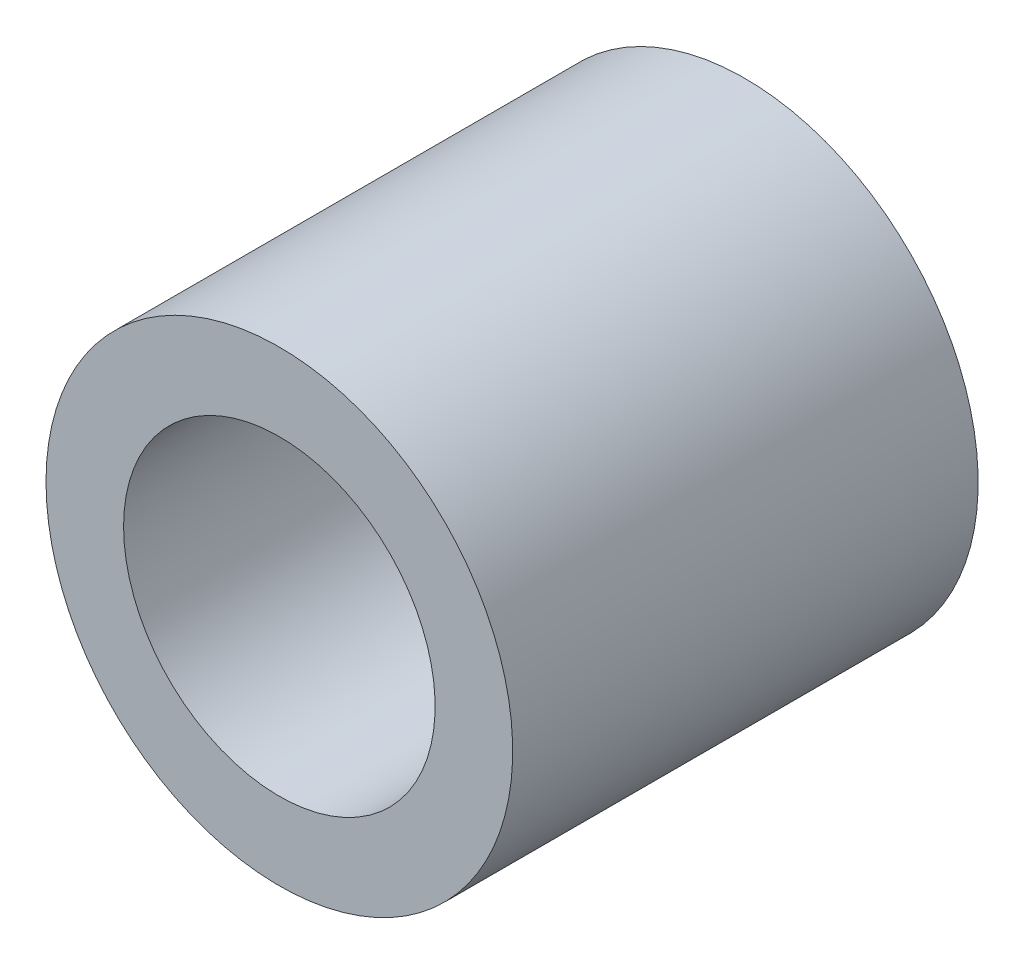
ISO-10303-21;
HEADER;
FILE_DESCRIPTION(('STEP AP214'),'2;1');
FILE_NAME('part.step','',(''),(''),'','','');
FILE_SCHEMA(('AUTOMOTIVE_DESIGN { 1 0 10303 214 1 1 1 1 }'));
ENDSEC;
DATA;
#1=APPLICATION_CONTEXT('core data for automotive mechanical design processes');
#2=APPLICATION_PROTOCOL_DEFINITION('international standard','automotive_design',2000,#1);
#3=PRODUCT_CONTEXT('',#1,'mechanical');
#4=PRODUCT('Part','Part','',(#3));
#5=PRODUCT_RELATED_PRODUCT_CATEGORY('part','',(#4));
#6=PRODUCT_DEFINITION_FORMATION('','',#4);
#7=PRODUCT_DEFINITION_CONTEXT('part definition',#1,'design');
#8=PRODUCT_DEFINITION('design','',#6,#7);
#9=PRODUCT_DEFINITION_SHAPE('','',#8);
#10=(LENGTH_UNIT() NAMED_UNIT(*) SI_UNIT(.MILLI.,.METRE.));
#11=(NAMED_UNIT(*) PLANE_ANGLE_UNIT() SI_UNIT($,.RADIAN.));
#12=(NAMED_UNIT(*) SI_UNIT($,.STERADIAN.) SOLID_ANGLE_UNIT());
#13=UNCERTAINTY_MEASURE_WITH_UNIT(LENGTH_MEASURE(1.E-05),#10,'distance_accuracy_value','');
#14=(GEOMETRIC_REPRESENTATION_CONTEXT(3) GLOBAL_UNCERTAINTY_ASSIGNED_CONTEXT((#13)) GLOBAL_UNIT_ASSIGNED_CONTEXT((#10,
#11,#12)) REPRESENTATION_CONTEXT('',''));
#15=CARTESIAN_POINT('',(0.,0.,0.));
#16=DIRECTION('',(0.,0.,1.));
#17=DIRECTION('',(1.,0.,0.));
#18=AXIS2_PLACEMENT_3D('',#15,#16,#17);
#19=CARTESIAN_POINT('',(0.,0.,4.7625));
#20=DIRECTION('',(0.,0.,1.));
#21=DIRECTION('',(1.,0.,0.));
#22=AXIS2_PLACEMENT_3D('',#19,#20,#21);
#23=PLANE('',#22);
#24=CARTESIAN_POINT('',(0.,0.,4.7625));
#25=DIRECTION('',(0.,0.,1.));
#26=DIRECTION('',(1.,0.,0.));
#27=AXIS2_PLACEMENT_3D('',#24,#25,#26);
#28=CIRCLE('',#27,4.7752);
#29=CARTESIAN_POINT('',(-4.7752,0.,4.7625));
#30=VERTEX_POINT('',#29);
#31=EDGE_CURVE('E10',#30,#30,#28,.T.);
#32=ORIENTED_EDGE('',*,*,#31,.T.);
#33=EDGE_LOOP('',(#32));
#34=FACE_BOUND('',#33,.T.);
#35=CARTESIAN_POINT('',(0.,0.,4.7625));
#36=DIRECTION('',(0.,0.,1.));
#37=DIRECTION('',(1.,0.,0.));
#38=AXIS2_PLACEMENT_3D('',#35,#36,#37);
#39=CIRCLE('',#38,3.1877);
#40=CARTESIAN_POINT('',(-3.1877,0.,4.7625));
#41=VERTEX_POINT('',#40);
#42=EDGE_CURVE('E47',#41,#41,#39,.T.);
#43=ORIENTED_EDGE('',*,*,#42,.F.);
#44=EDGE_LOOP('',(#43));
#45=FACE_BOUND('',#44,.T.);
#46=ADVANCED_FACE('F41',(#34,#45),#23,.T.);
#47=CARTESIAN_POINT('',(0.,0.,4.7625));
#48=DIRECTION('',(0.,0.,-1.));
#49=DIRECTION('',(-1.,0.,0.));
#50=AXIS2_PLACEMENT_3D('',#47,#48,#49);
#51=CYLINDRICAL_SURFACE('',#50,4.7752);
#52=CARTESIAN_POINT('',(0.,0.,-4.7625));
#53=DIRECTION('',(0.,0.,1.));
#54=DIRECTION('',(1.,0.,0.));
#55=AXIS2_PLACEMENT_3D('',#52,#53,#54);
#56=CIRCLE('',#55,4.7752);
#57=CARTESIAN_POINT('',(-4.7752,0.,-4.7625));
#58=VERTEX_POINT('',#57);
#59=EDGE_CURVE('E54',#58,#58,#56,.T.);
#60=CARTESIAN_POINT('',(-4.7752,0.,4.7625));
#61=CARTESIAN_POINT('',(-4.7752,0.,4.66328125));
#62=CARTESIAN_POINT('',(-4.7752,0.,4.5640625));
#63=CARTESIAN_POINT('',(-4.7752,0.,4.365625));
#64=CARTESIAN_POINT('',(-4.7752,0.,4.26640625));
#65=CARTESIAN_POINT('',(-4.7752,0.,4.06796875));
#66=CARTESIAN_POINT('',(-4.7752,0.,3.96875));
#67=CARTESIAN_POINT('',(-4.7752,0.,3.7703125));
#68=CARTESIAN_POINT('',(-4.7752,0.,3.67109375));
#69=CARTESIAN_POINT('',(-4.7752,0.,3.47265625));
#70=CARTESIAN_POINT('',(-4.7752,0.,3.3734375));
#71=CARTESIAN_POINT('',(-4.7752,0.,3.175));
#72=CARTESIAN_POINT('',(-4.7752,0.,3.07578125));
#73=CARTESIAN_POINT('',(-4.7752,0.,2.87734375));
#74=CARTESIAN_POINT('',(-4.7752,0.,2.778125));
#75=CARTESIAN_POINT('',(-4.7752,0.,2.5796875));
#76=CARTESIAN_POINT('',(-4.7752,0.,2.48046875));
#77=CARTESIAN_POINT('',(-4.7752,0.,2.28203125));
#78=CARTESIAN_POINT('',(-4.7752,0.,2.1828125));
#79=CARTESIAN_POINT('',(-4.7752,0.,1.984375));
#80=CARTESIAN_POINT('',(-4.7752,0.,1.88515625));
#81=CARTESIAN_POINT('',(-4.7752,0.,1.68671875));
#82=CARTESIAN_POINT('',(-4.7752,0.,1.5875));
#83=CARTESIAN_POINT('',(-4.7752,0.,1.3890625));
#84=CARTESIAN_POINT('',(-4.7752,0.,1.28984375));
#85=CARTESIAN_POINT('',(-4.7752,0.,1.09140625));
#86=CARTESIAN_POINT('',(-4.7752,0.,0.992187499999999));
#87=CARTESIAN_POINT('',(-4.7752,0.,0.79375));
#88=CARTESIAN_POINT('',(-4.7752,0.,0.69453125));
#89=CARTESIAN_POINT('',(-4.7752,0.,0.49609375));
#90=CARTESIAN_POINT('',(-4.7752,0.,0.396875));
#91=CARTESIAN_POINT('',(-4.7752,0.,0.1984375));
#92=CARTESIAN_POINT('',(-4.7752,0.,0.0992187500000001));
#93=CARTESIAN_POINT('',(-4.7752,0.,-0.0992187500000001));
#94=CARTESIAN_POINT('',(-4.7752,0.,-0.1984375));
#95=CARTESIAN_POINT('',(-4.7752,0.,-0.396875));
#96=CARTESIAN_POINT('',(-4.7752,0.,-0.49609375));
#97=CARTESIAN_POINT('',(-4.7752,0.,-0.69453125));
#98=CARTESIAN_POINT('',(-4.7752,0.,-0.793750000000001));
#99=CARTESIAN_POINT('',(-4.7752,0.,-0.992187500000001));
#100=CARTESIAN_POINT('',(-4.7752,0.,-1.09140625));
#101=CARTESIAN_POINT('',(-4.7752,0.,-1.28984375));
#102=CARTESIAN_POINT('',(-4.7752,0.,-1.3890625));
#103=CARTESIAN_POINT('',(-4.7752,0.,-1.5875));
#104=CARTESIAN_POINT('',(-4.7752,0.,-1.68671875));
#105=CARTESIAN_POINT('',(-4.7752,0.,-1.88515625));
#106=CARTESIAN_POINT('',(-4.7752,0.,-1.984375));
#107=CARTESIAN_POINT('',(-4.7752,0.,-2.1828125));
#108=CARTESIAN_POINT('',(-4.7752,0.,-2.28203125));
#109=CARTESIAN_POINT('',(-4.7752,0.,-2.48046875));
#110=CARTESIAN_POINT('',(-4.7752,0.,-2.5796875));
#111=CARTESIAN_POINT('',(-4.7752,0.,-2.778125));
#112=CARTESIAN_POINT('',(-4.7752,0.,-2.87734375));
#113=CARTESIAN_POINT('',(-4.7752,0.,-3.07578125));
#114=CARTESIAN_POINT('',(-4.7752,0.,-3.175));
#115=CARTESIAN_POINT('',(-4.7752,0.,-3.3734375));
#116=CARTESIAN_POINT('',(-4.7752,0.,-3.47265625));
#117=CARTESIAN_POINT('',(-4.7752,0.,-3.67109375));
#118=CARTESIAN_POINT('',(-4.7752,0.,-3.7703125));
#119=CARTESIAN_POINT('',(-4.7752,0.,-3.96875));
#120=CARTESIAN_POINT('',(-4.7752,0.,-4.06796875));
#121=CARTESIAN_POINT('',(-4.7752,0.,-4.26640625));
#122=CARTESIAN_POINT('',(-4.7752,0.,-4.365625));
#123=CARTESIAN_POINT('',(-4.7752,0.,-4.5640625));
#124=CARTESIAN_POINT('',(-4.7752,0.,-4.66328125));
#125=CARTESIAN_POINT('',(-4.7752,0.,-4.7625));
#126=B_SPLINE_CURVE_WITH_KNOTS('',3,(#60,#61,#62,#63,#64,#65,#66,#67,#68,#69,#70,#71,#72,#73,
#74,#75,#76,#77,#78,#79,#80,#81,#82,#83,#84,#85,#86,#87,#88,#89,#90,#91,#92,#93,#94,#95,#96,#97,
#98,#99,#100,#101,#102,#103,#104,#105,#106,#107,#108,#109,#110,#111,#112,#113,#114,#115,#116,
#117,#118,#119,#120,#121,#122,#123,#124,#125),.UNSPECIFIED.,.F.,.F.,(4,2,2,2,2,2,2,2,2,2,2,2,2,
2,2,2,2,2,2,2,2,2,2,2,2,2,2,2,2,2,2,2,4),(0.,0.29765625,0.5953125,0.892968750000001,1.190625,
1.48828125,1.7859375,2.08359375,2.38125,2.67890625,2.9765625,3.27421875,3.571875,3.86953125,
4.1671875,4.46484375,4.7625,5.06015625,5.3578125,5.65546875,5.953125,6.25078125,6.5484375,
6.84609375,7.14375,7.44140625,7.7390625,8.03671875,8.334375,8.63203125,8.9296875,9.22734375,
9.525),.UNSPECIFIED.);
#127=EDGE_CURVE('BSEAM43',#30,#58,#126,.T.);
#128=ORIENTED_EDGE('',*,*,#31,.F.);
#129=ORIENTED_EDGE('',*,*,#59,.T.);
#130=ORIENTED_EDGE('',*,*,#127,.T.);
#131=ORIENTED_EDGE('',*,*,#127,.F.);
#132=EDGE_LOOP('',(#128,#130,#129,#131));
#133=FACE_BOUND('',#132,.T.);
#134=ADVANCED_FACE('F43',(#133),#51,.T.);
#135=CARTESIAN_POINT('',(0.,0.,4.7625));
#136=DIRECTION('',(0.,0.,-1.));
#137=DIRECTION('',(-1.,0.,0.));
#138=AXIS2_PLACEMENT_3D('',#135,#136,#137);
#139=CYLINDRICAL_SURFACE('',#138,3.1877);
#140=CARTESIAN_POINT('',(0.,0.,-4.7625));
#141=DIRECTION('',(0.,0.,1.));
#142=DIRECTION('',(1.,0.,0.));
#143=AXIS2_PLACEMENT_3D('',#140,#141,#142);
#144=CIRCLE('',#143,3.1877);
#145=CARTESIAN_POINT('',(-3.1877,0.,-4.7625));
#146=VERTEX_POINT('',#145);
#147=EDGE_CURVE('E62',#146,#146,#144,.T.);
#148=CARTESIAN_POINT('',(-3.1877,0.,4.7625));
#149=CARTESIAN_POINT('',(-3.1877,0.,4.66328125));
#150=CARTESIAN_POINT('',(-3.1877,0.,4.5640625));
#151=CARTESIAN_POINT('',(-3.1877,0.,4.365625));
#152=CARTESIAN_POINT('',(-3.1877,0.,4.26640625));
#153=CARTESIAN_POINT('',(-3.1877,0.,4.06796875));
#154=CARTESIAN_POINT('',(-3.1877,0.,3.96875));
#155=CARTESIAN_POINT('',(-3.1877,0.,3.7703125));
#156=CARTESIAN_POINT('',(-3.1877,0.,3.67109375));
#157=CARTESIAN_POINT('',(-3.1877,0.,3.47265625));
#158=CARTESIAN_POINT('',(-3.1877,0.,3.3734375));
#159=CARTESIAN_POINT('',(-3.1877,0.,3.175));
#160=CARTESIAN_POINT('',(-3.1877,0.,3.07578125));
#161=CARTESIAN_POINT('',(-3.1877,0.,2.87734375));
#162=CARTESIAN_POINT('',(-3.1877,0.,2.778125));
#163=CARTESIAN_POINT('',(-3.1877,0.,2.5796875));
#164=CARTESIAN_POINT('',(-3.1877,0.,2.48046875));
#165=CARTESIAN_POINT('',(-3.1877,0.,2.28203125));
#166=CARTESIAN_POINT('',(-3.1877,0.,2.1828125));
#167=CARTESIAN_POINT('',(-3.1877,0.,1.984375));
#168=CARTESIAN_POINT('',(-3.1877,0.,1.88515625));
#169=CARTESIAN_POINT('',(-3.1877,0.,1.68671875));
#170=CARTESIAN_POINT('',(-3.1877,0.,1.5875));
#171=CARTESIAN_POINT('',(-3.1877,0.,1.3890625));
#172=CARTESIAN_POINT('',(-3.1877,0.,1.28984375));
#173=CARTESIAN_POINT('',(-3.1877,0.,1.09140625));
#174=CARTESIAN_POINT('',(-3.1877,0.,0.992187499999999));
#175=CARTESIAN_POINT('',(-3.1877,0.,0.793749999999999));
#176=CARTESIAN_POINT('',(-3.1877,0.,0.694531249999999));
#177=CARTESIAN_POINT('',(-3.1877,0.,0.496093749999999));
#178=CARTESIAN_POINT('',(-3.1877,0.,0.396874999999999));
#179=CARTESIAN_POINT('',(-3.1877,0.,0.198437499999999));
#180=CARTESIAN_POINT('',(-3.1877,0.,0.0992187499999992));
#181=CARTESIAN_POINT('',(-3.1877,0.,-0.0992187500000009));
#182=CARTESIAN_POINT('',(-3.1877,0.,-0.198437500000001));
#183=CARTESIAN_POINT('',(-3.1877,0.,-0.396875000000001));
#184=CARTESIAN_POINT('',(-3.1877,0.,-0.496093750000001));
#185=CARTESIAN_POINT('',(-3.1877,0.,-0.694531250000001));
#186=CARTESIAN_POINT('',(-3.1877,0.,-0.793750000000001));
#187=CARTESIAN_POINT('',(-3.1877,0.,-0.992187500000002));
#188=CARTESIAN_POINT('',(-3.1877,0.,-1.09140625));
#189=CARTESIAN_POINT('',(-3.1877,0.,-1.28984375));
#190=CARTESIAN_POINT('',(-3.1877,0.,-1.3890625));
#191=CARTESIAN_POINT('',(-3.1877,0.,-1.5875));
#192=CARTESIAN_POINT('',(-3.1877,0.,-1.68671875));
#193=CARTESIAN_POINT('',(-3.1877,0.,-1.88515625));
#194=CARTESIAN_POINT('',(-3.1877,0.,-1.984375));
#195=CARTESIAN_POINT('',(-3.1877,0.,-2.1828125));
#196=CARTESIAN_POINT('',(-3.1877,0.,-2.28203125));
#197=CARTESIAN_POINT('',(-3.1877,0.,-2.48046875));
#198=CARTESIAN_POINT('',(-3.1877,0.,-2.5796875));
#199=CARTESIAN_POINT('',(-3.1877,0.,-2.778125));
#200=CARTESIAN_POINT('',(-3.1877,0.,-2.87734375));
#201=CARTESIAN_POINT('',(-3.1877,0.,-3.07578125));
#202=CARTESIAN_POINT('',(-3.1877,0.,-3.175));
#203=CARTESIAN_POINT('',(-3.1877,0.,-3.3734375));
#204=CARTESIAN_POINT('',(-3.1877,0.,-3.47265625));
#205=CARTESIAN_POINT('',(-3.1877,0.,-3.67109375));
#206=CARTESIAN_POINT('',(-3.1877,0.,-3.7703125));
#207=CARTESIAN_POINT('',(-3.1877,0.,-3.96875));
#208=CARTESIAN_POINT('',(-3.1877,0.,-4.06796875));
#209=CARTESIAN_POINT('',(-3.1877,0.,-4.26640625));
#210=CARTESIAN_POINT('',(-3.1877,0.,-4.365625));
#211=CARTESIAN_POINT('',(-3.1877,0.,-4.5640625));
#212=CARTESIAN_POINT('',(-3.1877,0.,-4.66328125));
#213=CARTESIAN_POINT('',(-3.1877,0.,-4.7625));
#214=B_SPLINE_CURVE_WITH_KNOTS('',3,(#148,#149,#150,#151,#152,#153,#154,#155,#156,#157,#158,
#159,#160,#161,#162,#163,#164,#165,#166,#167,#168,#169,#170,#171,#172,#173,#174,#175,#176,#177,
#178,#179,#180,#181,#182,#183,#184,#185,#186,#187,#188,#189,#190,#191,#192,#193,#194,#195,#196,
#197,#198,#199,#200,#201,#202,#203,#204,#205,#206,#207,#208,#209,#210,#211,#212,#213),
.UNSPECIFIED.,.F.,.F.,(4,2,2,2,2,2,2,2,2,2,2,2,2,2,2,2,2,2,2,2,2,2,2,2,2,2,2,2,2,2,2,2,4),(0.,
0.297656249999999,0.595312499999999,0.89296875,1.190625,1.48828125,1.7859375,2.08359375,2.38125,
2.67890625,2.9765625,3.27421875,3.571875,3.86953125,4.1671875,4.46484375,4.7625,5.06015625,
5.3578125,5.65546875,5.953125,6.25078125,6.5484375,6.84609375,7.14375,7.44140625,7.7390625,
8.03671875,8.334375,8.63203125,8.9296875,9.22734375,9.525),.UNSPECIFIED.);
#215=EDGE_CURVE('BSEAM75',#41,#146,#214,.T.);
#216=ORIENTED_EDGE('',*,*,#42,.T.);
#217=ORIENTED_EDGE('',*,*,#147,.F.);
#218=ORIENTED_EDGE('',*,*,#215,.T.);
#219=ORIENTED_EDGE('',*,*,#215,.F.);
#220=EDGE_LOOP('',(#216,#218,#217,#219));
#221=FACE_BOUND('',#220,.T.);
#222=ADVANCED_FACE('F75',(#221),#139,.F.);
#223=CARTESIAN_POINT('',(0.,0.,-4.7625));
#224=DIRECTION('',(0.,0.,1.));
#225=DIRECTION('',(1.,0.,0.));
#226=AXIS2_PLACEMENT_3D('',#223,#224,#225);
#227=PLANE('',#226);
#228=ORIENTED_EDGE('',*,*,#147,.T.);
#229=EDGE_LOOP('',(#228));
#230=FACE_BOUND('',#229,.T.);
#231=ORIENTED_EDGE('',*,*,#59,.F.);
#232=EDGE_LOOP('',(#231));
#233=FACE_BOUND('',#232,.T.);
#234=ADVANCED_FACE('F66',(#230,#233),#227,.F.);
#235=CLOSED_SHELL('',(#46,#134,#222,#234));
#236=MANIFOLD_SOLID_BREP('B2',#235);
#237=ADVANCED_BREP_SHAPE_REPRESENTATION('',(#18,#236),#14);
#238=SHAPE_DEFINITION_REPRESENTATION(#9,#237);
ENDSEC;
END-ISO-10303-21;
